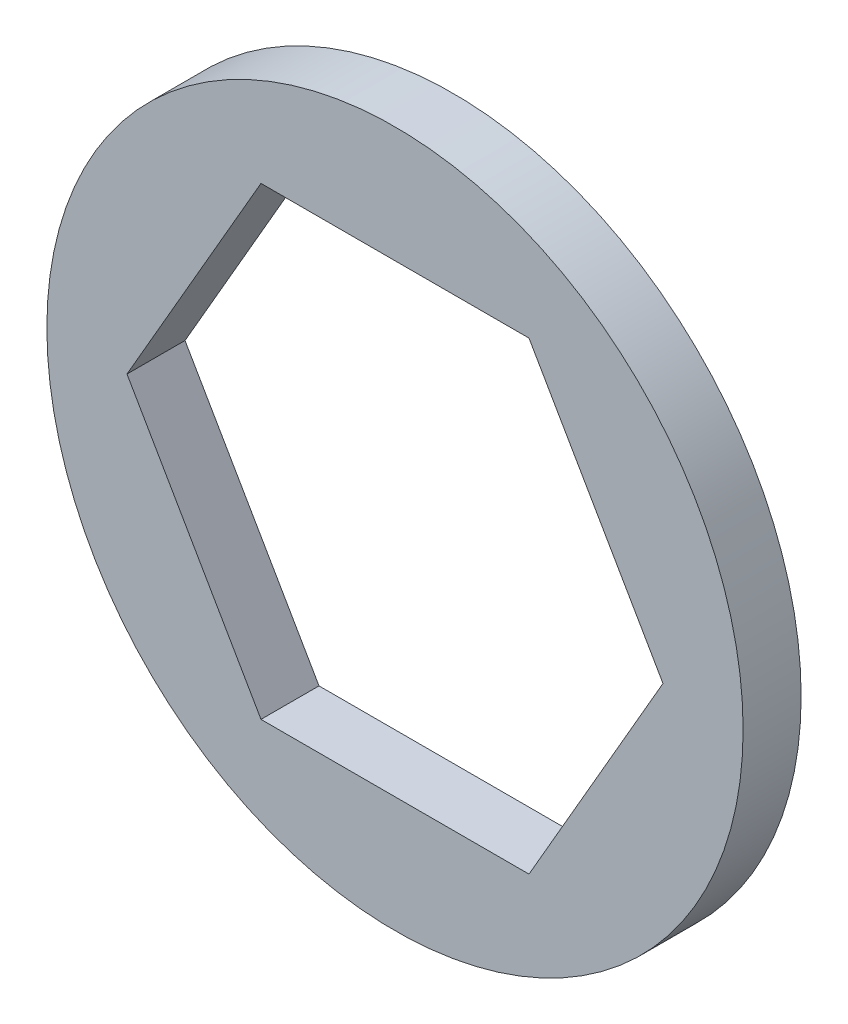
ISO-10303-21;
HEADER;
FILE_DESCRIPTION(('STEP AP214'),'2;1');
FILE_NAME('part.step','',(''),(''),'','','');
FILE_SCHEMA(('AUTOMOTIVE_DESIGN { 1 0 10303 214 1 1 1 1 }'));
ENDSEC;
DATA;
#1=APPLICATION_CONTEXT('core data for automotive mechanical design processes');
#2=APPLICATION_PROTOCOL_DEFINITION('international standard','automotive_design',2000,#1);
#3=PRODUCT_CONTEXT('',#1,'mechanical');
#4=PRODUCT('Part','Part','',(#3));
#5=PRODUCT_RELATED_PRODUCT_CATEGORY('part','',(#4));
#6=PRODUCT_DEFINITION_FORMATION('','',#4);
#7=PRODUCT_DEFINITION_CONTEXT('part definition',#1,'design');
#8=PRODUCT_DEFINITION('design','',#6,#7);
#9=PRODUCT_DEFINITION_SHAPE('','',#8);
#10=(LENGTH_UNIT() NAMED_UNIT(*) SI_UNIT(.MILLI.,.METRE.));
#11=(NAMED_UNIT(*) PLANE_ANGLE_UNIT() SI_UNIT($,.RADIAN.));
#12=(NAMED_UNIT(*) SI_UNIT($,.STERADIAN.) SOLID_ANGLE_UNIT());
#13=UNCERTAINTY_MEASURE_WITH_UNIT(LENGTH_MEASURE(1.E-05),#10,'distance_accuracy_value','');
#14=(GEOMETRIC_REPRESENTATION_CONTEXT(3) GLOBAL_UNCERTAINTY_ASSIGNED_CONTEXT((#13)) GLOBAL_UNIT_ASSIGNED_CONTEXT((#10,
#11,#12)) REPRESENTATION_CONTEXT('',''));
#15=CARTESIAN_POINT('',(0.,0.,0.));
#16=DIRECTION('',(0.,0.,1.));
#17=DIRECTION('',(1.,0.,0.));
#18=AXIS2_PLACEMENT_3D('',#15,#16,#17);
#19=CARTESIAN_POINT('',(0.,0.,1.5875));
#20=DIRECTION('',(0.,0.,1.));
#21=DIRECTION('',(1.,0.,0.));
#22=AXIS2_PLACEMENT_3D('',#19,#20,#21);
#23=PLANE('',#22);
#24=CARTESIAN_POINT('',(0.,0.,1.5875));
#25=DIRECTION('',(0.,0.,1.));
#26=DIRECTION('',(1.,0.,0.));
#27=AXIS2_PLACEMENT_3D('',#24,#25,#26);
#28=CIRCLE('',#27,9.525);
#29=CARTESIAN_POINT('',(9.525,0.,1.5875));
#30=VERTEX_POINT('',#29);
#31=EDGE_CURVE('E11',#30,#30,#28,.T.);
#32=ORIENTED_EDGE('',*,*,#31,.T.);
#33=EDGE_LOOP('',(#32));
#34=FACE_BOUND('',#33,.T.);
#35=DIRECTION('',(-0.500000000000001,0.866025403784438,0.));
#36=VECTOR('',#35,1.);
#37=CARTESIAN_POINT('',(7.33234841870821,0.,1.5875));
#38=LINE('',#37,#36);
#39=CARTESIAN_POINT('',(7.33234841870821,0.,1.5875));
#40=VERTEX_POINT('',#39);
#41=CARTESIAN_POINT('',(3.66617420935409,6.34999999999998,1.5875));
#42=VERTEX_POINT('',#41);
#43=EDGE_CURVE('E100',#40,#42,#38,.T.);
#44=ORIENTED_EDGE('',*,*,#43,.F.);
#45=DIRECTION('',(0.499999999999995,0.866025403784441,0.));
#46=VECTOR('',#45,1.);
#47=CARTESIAN_POINT('',(3.66617420935418,-6.34999999999992,1.5875));
#48=LINE('',#47,#46);
#49=CARTESIAN_POINT('',(3.66617420935418,-6.34999999999992,1.5875));
#50=VERTEX_POINT('',#49);
#51=EDGE_CURVE('E92',#50,#40,#48,.T.);
#52=ORIENTED_EDGE('',*,*,#51,.F.);
#53=DIRECTION('',(1.,0.,0.));
#54=VECTOR('',#53,1.);
#55=CARTESIAN_POINT('',(-3.66617420935405,-6.35,1.5875));
#56=LINE('',#55,#54);
#57=CARTESIAN_POINT('',(-3.66617420935405,-6.35,1.5875));
#58=VERTEX_POINT('',#57);
#59=EDGE_CURVE('E120',#58,#50,#56,.T.);
#60=ORIENTED_EDGE('',*,*,#59,.F.);
#61=DIRECTION('',(0.500000000000007,-0.866025403784435,0.));
#62=VECTOR('',#61,1.);
#63=CARTESIAN_POINT('',(-7.33234841870821,0.,1.5875));
#64=LINE('',#63,#62);
#65=CARTESIAN_POINT('',(-7.33234841870821,0.,1.5875));
#66=VERTEX_POINT('',#65);
#67=EDGE_CURVE('E118',#66,#58,#64,.T.);
#68=ORIENTED_EDGE('',*,*,#67,.F.);
#69=DIRECTION('',(-0.499999999999995,-0.866025403784441,0.));
#70=VECTOR('',#69,1.);
#71=CARTESIAN_POINT('',(-3.66617420935413,6.34999999999995,1.5875));
#72=LINE('',#71,#70);
#73=CARTESIAN_POINT('',(-3.66617420935413,6.34999999999995,1.5875));
#74=VERTEX_POINT('',#73);
#75=EDGE_CURVE('E114',#74,#66,#72,.T.);
#76=ORIENTED_EDGE('',*,*,#75,.F.);
#77=DIRECTION('',(-1.,0.,0.));
#78=VECTOR('',#77,1.);
#79=CARTESIAN_POINT('',(3.66617420935409,6.34999999999998,1.5875));
#80=LINE('',#79,#78);
#81=EDGE_CURVE('E112',#42,#74,#80,.T.);
#82=ORIENTED_EDGE('',*,*,#81,.F.);
#83=EDGE_LOOP('',(#44,#52,#60,#68,#76,#82));
#84=FACE_BOUND('',#83,.T.);
#85=ADVANCED_FACE('F39',(#34,#84),#23,.T.);
#86=CARTESIAN_POINT('',(0.,0.,0.));
#87=DIRECTION('',(0.,0.,1.));
#88=DIRECTION('',(1.,0.,0.));
#89=AXIS2_PLACEMENT_3D('',#86,#87,#88);
#90=PLANE('',#89);
#91=CARTESIAN_POINT('',(0.,0.,0.));
#92=DIRECTION('',(0.,0.,1.));
#93=DIRECTION('',(1.,0.,0.));
#94=AXIS2_PLACEMENT_3D('',#91,#92,#93);
#95=CIRCLE('',#94,9.525);
#96=CARTESIAN_POINT('',(9.525,0.,0.));
#97=VERTEX_POINT('',#96);
#98=EDGE_CURVE('E43',#97,#97,#95,.T.);
#99=ORIENTED_EDGE('',*,*,#98,.F.);
#100=EDGE_LOOP('',(#99));
#101=FACE_BOUND('',#100,.T.);
#102=DIRECTION('',(0.499999999999995,0.866025403784441,0.));
#103=VECTOR('',#102,1.);
#104=CARTESIAN_POINT('',(3.66617420935418,-6.34999999999992,0.));
#105=LINE('',#104,#103);
#106=CARTESIAN_POINT('',(3.66617420935418,-6.34999999999992,0.));
#107=VERTEX_POINT('',#106);
#108=CARTESIAN_POINT('',(7.33234841870821,0.,0.));
#109=VERTEX_POINT('',#108);
#110=EDGE_CURVE('E62',#107,#109,#105,.T.);
#111=ORIENTED_EDGE('',*,*,#110,.T.);
#112=DIRECTION('',(-0.500000000000001,0.866025403784438,0.));
#113=VECTOR('',#112,1.);
#114=CARTESIAN_POINT('',(7.33234841870821,0.,0.));
#115=LINE('',#114,#113);
#116=CARTESIAN_POINT('',(3.66617420935409,6.34999999999998,0.));
#117=VERTEX_POINT('',#116);
#118=EDGE_CURVE('E107',#109,#117,#115,.T.);
#119=ORIENTED_EDGE('',*,*,#118,.T.);
#120=DIRECTION('',(-1.,0.,0.));
#121=VECTOR('',#120,1.);
#122=CARTESIAN_POINT('',(3.66617420935409,6.34999999999998,0.));
#123=LINE('',#122,#121);
#124=CARTESIAN_POINT('',(-3.66617420935413,6.34999999999995,0.));
#125=VERTEX_POINT('',#124);
#126=EDGE_CURVE('E124',#117,#125,#123,.T.);
#127=ORIENTED_EDGE('',*,*,#126,.T.);
#128=DIRECTION('',(-0.499999999999995,-0.866025403784441,0.));
#129=VECTOR('',#128,1.);
#130=CARTESIAN_POINT('',(-3.66617420935413,6.34999999999995,0.));
#131=LINE('',#130,#129);
#132=CARTESIAN_POINT('',(-7.33234841870821,0.,0.));
#133=VERTEX_POINT('',#132);
#134=EDGE_CURVE('E127',#125,#133,#131,.T.);
#135=ORIENTED_EDGE('',*,*,#134,.T.);
#136=DIRECTION('',(0.500000000000007,-0.866025403784435,0.));
#137=VECTOR('',#136,1.);
#138=CARTESIAN_POINT('',(-7.33234841870821,0.,0.));
#139=LINE('',#138,#137);
#140=CARTESIAN_POINT('',(-3.66617420935405,-6.35,0.));
#141=VERTEX_POINT('',#140);
#142=EDGE_CURVE('E130',#133,#141,#139,.T.);
#143=ORIENTED_EDGE('',*,*,#142,.T.);
#144=DIRECTION('',(1.,0.,0.));
#145=VECTOR('',#144,1.);
#146=CARTESIAN_POINT('',(-3.66617420935405,-6.35,0.));
#147=LINE('',#146,#145);
#148=EDGE_CURVE('E101',#141,#107,#147,.T.);
#149=ORIENTED_EDGE('',*,*,#148,.T.);
#150=EDGE_LOOP('',(#111,#119,#127,#135,#143,#149));
#151=FACE_BOUND('',#150,.T.);
#152=ADVANCED_FACE('F147',(#101,#151),#90,.F.);
#153=CARTESIAN_POINT('',(0.,0.,1.5875));
#154=DIRECTION('',(0.,0.,-1.));
#155=DIRECTION('',(-1.,0.,0.));
#156=AXIS2_PLACEMENT_3D('',#153,#154,#155);
#157=CYLINDRICAL_SURFACE('',#156,9.525);
#158=ORIENTED_EDGE('',*,*,#31,.F.);
#159=EDGE_LOOP('',(#158));
#160=FACE_BOUND('',#159,.T.);
#161=ORIENTED_EDGE('',*,*,#98,.T.);
#162=EDGE_LOOP('',(#161));
#163=FACE_BOUND('',#162,.T.);
#164=ADVANCED_FACE('F41',(#160,#163),#157,.T.);
#165=CARTESIAN_POINT('',(3.66617420935418,-6.34999999999992,1.5875));
#166=DIRECTION('',(-0.866025403784441,0.499999999999995,0.));
#167=DIRECTION('',(-0.499999999999995,-0.866025403784441,0.));
#168=AXIS2_PLACEMENT_3D('',#165,#166,#167);
#169=PLANE('',#168);
#170=ORIENTED_EDGE('',*,*,#110,.F.);
#171=DIRECTION('',(0.,0.,-1.));
#172=VECTOR('',#171,1.);
#173=CARTESIAN_POINT('',(3.66617420935418,-6.34999999999992,1.5875));
#174=LINE('',#173,#172);
#175=EDGE_CURVE('E96',#50,#107,#174,.T.);
#176=ORIENTED_EDGE('',*,*,#175,.F.);
#177=ORIENTED_EDGE('',*,*,#51,.T.);
#178=DIRECTION('',(0.,0.,-1.));
#179=VECTOR('',#178,1.);
#180=CARTESIAN_POINT('',(7.33234841870821,0.,1.5875));
#181=LINE('',#180,#179);
#182=EDGE_CURVE('E95',#40,#109,#181,.T.);
#183=ORIENTED_EDGE('',*,*,#182,.T.);
#184=EDGE_LOOP('',(#170,#176,#177,#183));
#185=FACE_BOUND('',#184,.T.);
#186=ADVANCED_FACE('F94',(#185),#169,.T.);
#187=CARTESIAN_POINT('',(7.33234841870821,0.,1.5875));
#188=DIRECTION('',(-0.866025403784438,-0.500000000000001,0.));
#189=DIRECTION('',(0.500000000000001,-0.866025403784438,0.));
#190=AXIS2_PLACEMENT_3D('',#187,#188,#189);
#191=PLANE('',#190);
#192=ORIENTED_EDGE('',*,*,#118,.F.);
#193=ORIENTED_EDGE('',*,*,#182,.F.);
#194=ORIENTED_EDGE('',*,*,#43,.T.);
#195=DIRECTION('',(0.,0.,-1.));
#196=VECTOR('',#195,1.);
#197=CARTESIAN_POINT('',(3.66617420935409,6.34999999999998,1.5875));
#198=LINE('',#197,#196);
#199=EDGE_CURVE('E108',#42,#117,#198,.T.);
#200=ORIENTED_EDGE('',*,*,#199,.T.);
#201=EDGE_LOOP('',(#192,#193,#194,#200));
#202=FACE_BOUND('',#201,.T.);
#203=ADVANCED_FACE('F104',(#202),#191,.T.);
#204=CARTESIAN_POINT('',(3.66617420935409,6.34999999999998,1.5875));
#205=DIRECTION('',(0.,-1.,0.));
#206=DIRECTION('',(1.,0.,0.));
#207=AXIS2_PLACEMENT_3D('',#204,#205,#206);
#208=PLANE('',#207);
#209=ORIENTED_EDGE('',*,*,#126,.F.);
#210=ORIENTED_EDGE('',*,*,#199,.F.);
#211=ORIENTED_EDGE('',*,*,#81,.T.);
#212=DIRECTION('',(0.,0.,-1.));
#213=VECTOR('',#212,1.);
#214=CARTESIAN_POINT('',(-3.66617420935413,6.34999999999995,1.5875));
#215=LINE('',#214,#213);
#216=EDGE_CURVE('E139',#74,#125,#215,.T.);
#217=ORIENTED_EDGE('',*,*,#216,.T.);
#218=EDGE_LOOP('',(#209,#210,#211,#217));
#219=FACE_BOUND('',#218,.T.);
#220=ADVANCED_FACE('F143',(#219),#208,.T.);
#221=CARTESIAN_POINT('',(-3.66617420935413,6.34999999999995,1.5875));
#222=DIRECTION('',(0.866025403784441,-0.499999999999995,0.));
#223=DIRECTION('',(0.499999999999995,0.866025403784442,0.));
#224=AXIS2_PLACEMENT_3D('',#221,#222,#223);
#225=PLANE('',#224);
#226=ORIENTED_EDGE('',*,*,#134,.F.);
#227=ORIENTED_EDGE('',*,*,#216,.F.);
#228=ORIENTED_EDGE('',*,*,#75,.T.);
#229=DIRECTION('',(0.,0.,-1.));
#230=VECTOR('',#229,1.);
#231=CARTESIAN_POINT('',(-7.33234841870821,0.,1.5875));
#232=LINE('',#231,#230);
#233=EDGE_CURVE('E137',#66,#133,#232,.T.);
#234=ORIENTED_EDGE('',*,*,#233,.T.);
#235=EDGE_LOOP('',(#226,#227,#228,#234));
#236=FACE_BOUND('',#235,.T.);
#237=ADVANCED_FACE('F155',(#236),#225,.T.);
#238=CARTESIAN_POINT('',(-7.33234841870821,0.,1.5875));
#239=DIRECTION('',(0.866025403784434,0.500000000000007,0.));
#240=DIRECTION('',(-0.500000000000007,0.866025403784435,0.));
#241=AXIS2_PLACEMENT_3D('',#238,#239,#240);
#242=PLANE('',#241);
#243=ORIENTED_EDGE('',*,*,#142,.F.);
#244=ORIENTED_EDGE('',*,*,#233,.F.);
#245=ORIENTED_EDGE('',*,*,#67,.T.);
#246=DIRECTION('',(0.,0.,-1.));
#247=VECTOR('',#246,1.);
#248=CARTESIAN_POINT('',(-3.66617420935405,-6.35,1.5875));
#249=LINE('',#248,#247);
#250=EDGE_CURVE('E54',#58,#141,#249,.T.);
#251=ORIENTED_EDGE('',*,*,#250,.T.);
#252=EDGE_LOOP('',(#243,#244,#245,#251));
#253=FACE_BOUND('',#252,.T.);
#254=ADVANCED_FACE('F153',(#253),#242,.T.);
#255=CARTESIAN_POINT('',(-3.66617420935405,-6.35,1.5875));
#256=DIRECTION('',(0.,1.,0.));
#257=DIRECTION('',(-1.,0.,0.));
#258=AXIS2_PLACEMENT_3D('',#255,#256,#257);
#259=PLANE('',#258);
#260=ORIENTED_EDGE('',*,*,#148,.F.);
#261=ORIENTED_EDGE('',*,*,#250,.F.);
#262=ORIENTED_EDGE('',*,*,#59,.T.);
#263=ORIENTED_EDGE('',*,*,#175,.T.);
#264=EDGE_LOOP('',(#260,#261,#262,#263));
#265=FACE_BOUND('',#264,.T.);
#266=ADVANCED_FACE('F149',(#265),#259,.T.);
#267=CLOSED_SHELL('',(#85,#152,#164,#186,#203,#220,#237,#254,#266));
#268=MANIFOLD_SOLID_BREP('B2',#267);
#269=ADVANCED_BREP_SHAPE_REPRESENTATION('',(#18,#268),#14);
#270=SHAPE_DEFINITION_REPRESENTATION(#9,#269);
ENDSEC;
END-ISO-10303-21;
